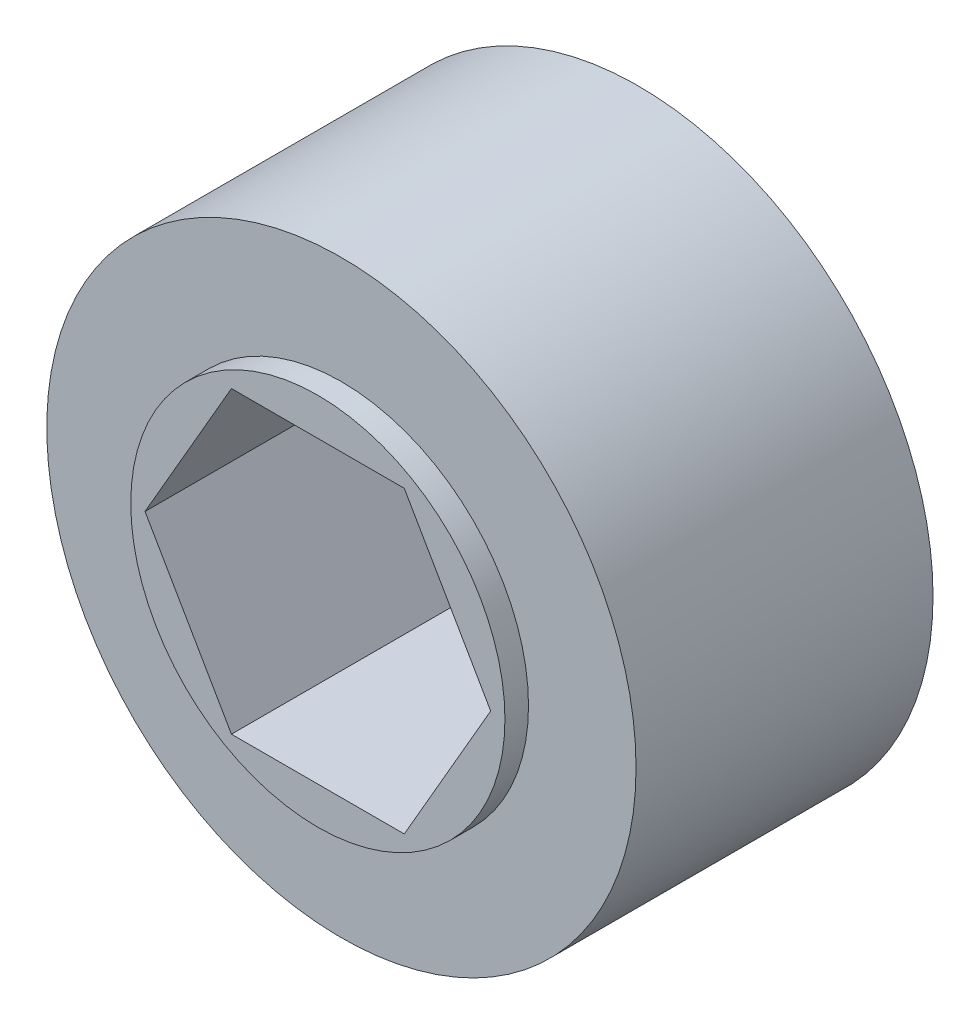
ISO-10303-21;
HEADER;
FILE_DESCRIPTION(('STEP AP214'),'2;1');
FILE_NAME('part.step','',(''),(''),'','','');
FILE_SCHEMA(('AUTOMOTIVE_DESIGN { 1 0 10303 214 1 1 1 1 }'));
ENDSEC;
DATA;
#1=APPLICATION_CONTEXT('core data for automotive mechanical design processes');
#2=APPLICATION_PROTOCOL_DEFINITION('international standard','automotive_design',2000,#1);
#3=PRODUCT_CONTEXT('',#1,'mechanical');
#4=PRODUCT('Part','Part','',(#3));
#5=PRODUCT_RELATED_PRODUCT_CATEGORY('part','',(#4));
#6=PRODUCT_DEFINITION_FORMATION('','',#4);
#7=PRODUCT_DEFINITION_CONTEXT('part definition',#1,'design');
#8=PRODUCT_DEFINITION('design','',#6,#7);
#9=PRODUCT_DEFINITION_SHAPE('','',#8);
#10=(LENGTH_UNIT() NAMED_UNIT(*) SI_UNIT(.MILLI.,.METRE.));
#11=(NAMED_UNIT(*) PLANE_ANGLE_UNIT() SI_UNIT($,.RADIAN.));
#12=(NAMED_UNIT(*) SI_UNIT($,.STERADIAN.) SOLID_ANGLE_UNIT());
#13=UNCERTAINTY_MEASURE_WITH_UNIT(LENGTH_MEASURE(1.E-05),#10,'distance_accuracy_value','');
#14=(GEOMETRIC_REPRESENTATION_CONTEXT(3) GLOBAL_UNCERTAINTY_ASSIGNED_CONTEXT((#13)) GLOBAL_UNIT_ASSIGNED_CONTEXT((#10,
#11,#12)) REPRESENTATION_CONTEXT('',''));
#15=CARTESIAN_POINT('',(0.,0.,0.));
#16=DIRECTION('',(0.,0.,1.));
#17=DIRECTION('',(1.,0.,0.));
#18=AXIS2_PLACEMENT_3D('',#15,#16,#17);
#19=CARTESIAN_POINT('',(0.,0.,6.8));
#20=DIRECTION('',(0.,0.,1.));
#21=DIRECTION('',(1.,0.,0.));
#22=AXIS2_PLACEMENT_3D('',#19,#20,#21);
#23=PLANE('',#22);
#24=DIRECTION('',(-0.5,0.866025403784438,0.));
#25=VECTOR('',#24,1.);
#26=CARTESIAN_POINT('',(7.33234841870825,0.,6.8));
#27=LINE('',#26,#25);
#28=CARTESIAN_POINT('',(7.33234841870825,0.,6.8));
#29=VERTEX_POINT('',#28);
#30=CARTESIAN_POINT('',(3.66617420935412,6.35,6.8));
#31=VERTEX_POINT('',#30);
#32=EDGE_CURVE('E101',#29,#31,#27,.T.);
#33=ORIENTED_EDGE('',*,*,#32,.F.);
#34=DIRECTION('',(0.5,0.866025403784438,0.));
#35=VECTOR('',#34,1.);
#36=CARTESIAN_POINT('',(3.66617420935413,-6.35,6.8));
#37=LINE('',#36,#35);
#38=CARTESIAN_POINT('',(3.66617420935413,-6.35,6.8));
#39=VERTEX_POINT('',#38);
#40=EDGE_CURVE('E93',#39,#29,#37,.T.);
#41=ORIENTED_EDGE('',*,*,#40,.F.);
#42=DIRECTION('',(1.,0.,0.));
#43=VECTOR('',#42,1.);
#44=CARTESIAN_POINT('',(-3.66617420935412,-6.35,6.8));
#45=LINE('',#44,#43);
#46=CARTESIAN_POINT('',(-3.66617420935412,-6.35,6.8));
#47=VERTEX_POINT('',#46);
#48=EDGE_CURVE('E127',#47,#39,#45,.T.);
#49=ORIENTED_EDGE('',*,*,#48,.F.);
#50=DIRECTION('',(0.5,-0.866025403784439,0.));
#51=VECTOR('',#50,1.);
#52=CARTESIAN_POINT('',(-7.33234841870825,0.,6.8));
#53=LINE('',#52,#51);
#54=CARTESIAN_POINT('',(-7.33234841870825,0.,6.8));
#55=VERTEX_POINT('',#54);
#56=EDGE_CURVE('E124',#55,#47,#53,.T.);
#57=ORIENTED_EDGE('',*,*,#56,.F.);
#58=DIRECTION('',(-0.5,-0.866025403784438,0.));
#59=VECTOR('',#58,1.);
#60=CARTESIAN_POINT('',(-3.66617420935413,6.35,6.8));
#61=LINE('',#60,#59);
#62=CARTESIAN_POINT('',(-3.66617420935413,6.35,6.8));
#63=VERTEX_POINT('',#62);
#64=EDGE_CURVE('E118',#63,#55,#61,.T.);
#65=ORIENTED_EDGE('',*,*,#64,.F.);
#66=DIRECTION('',(-1.,0.,0.));
#67=VECTOR('',#66,1.);
#68=CARTESIAN_POINT('',(3.66617420935412,6.35,6.8));
#69=LINE('',#68,#67);
#70=EDGE_CURVE('E114',#31,#63,#69,.T.);
#71=ORIENTED_EDGE('',*,*,#70,.F.);
#72=EDGE_LOOP('',(#33,#41,#49,#57,#65,#71));
#73=FACE_BOUND('',#72,.T.);
#74=CARTESIAN_POINT('',(0.,0.,6.8));
#75=DIRECTION('',(0.,0.,1.));
#76=DIRECTION('',(1.,0.,0.));
#77=AXIS2_PLACEMENT_3D('',#74,#75,#76);
#78=CIRCLE('',#77,7.9375);
#79=CARTESIAN_POINT('',(7.9375,0.,6.8));
#80=VERTEX_POINT('',#79);
#81=EDGE_CURVE('E206',#80,#80,#78,.T.);
#82=ORIENTED_EDGE('',*,*,#81,.T.);
#83=EDGE_LOOP('',(#82));
#84=FACE_BOUND('',#83,.T.);
#85=ADVANCED_FACE('F39',(#73,#84),#23,.T.);
#86=CARTESIAN_POINT('',(0.,0.,6.8));
#87=DIRECTION('',(0.,0.,-1.));
#88=DIRECTION('',(-1.,0.,0.));
#89=AXIS2_PLACEMENT_3D('',#86,#87,#88);
#90=CYLINDRICAL_SURFACE('',#89,12.5);
#91=CARTESIAN_POINT('',(0.,0.,-6.8));
#92=DIRECTION('',(0.,0.,1.));
#93=DIRECTION('',(1.,0.,0.));
#94=AXIS2_PLACEMENT_3D('',#91,#92,#93);
#95=CIRCLE('',#94,12.5);
#96=CARTESIAN_POINT('',(12.5,0.,-6.8));
#97=VERTEX_POINT('',#96);
#98=EDGE_CURVE('E11',#97,#97,#95,.T.);
#99=ORIENTED_EDGE('',*,*,#98,.T.);
#100=EDGE_LOOP('',(#99));
#101=FACE_BOUND('',#100,.T.);
#102=CARTESIAN_POINT('',(0.,0.,5.8));
#103=DIRECTION('',(0.,0.,1.));
#104=DIRECTION('',(1.,0.,0.));
#105=AXIS2_PLACEMENT_3D('',#102,#103,#104);
#106=CIRCLE('',#105,12.5);
#107=CARTESIAN_POINT('',(12.5,0.,5.8));
#108=VERTEX_POINT('',#107);
#109=EDGE_CURVE('E132',#108,#108,#106,.T.);
#110=ORIENTED_EDGE('',*,*,#109,.F.);
#111=EDGE_LOOP('',(#110));
#112=FACE_BOUND('',#111,.T.);
#113=ADVANCED_FACE('F41',(#101,#112),#90,.T.);
#114=CARTESIAN_POINT('',(0.,0.,-6.8));
#115=DIRECTION('',(0.,0.,1.));
#116=DIRECTION('',(1.,0.,0.));
#117=AXIS2_PLACEMENT_3D('',#114,#115,#116);
#118=PLANE('',#117);
#119=ORIENTED_EDGE('',*,*,#98,.F.);
#120=EDGE_LOOP('',(#119));
#121=FACE_BOUND('',#120,.T.);
#122=DIRECTION('',(0.5,0.866025403784438,0.));
#123=VECTOR('',#122,1.);
#124=CARTESIAN_POINT('',(3.66617420935413,-6.35,-6.8));
#125=LINE('',#124,#123);
#126=CARTESIAN_POINT('',(3.66617420935413,-6.35,-6.8));
#127=VERTEX_POINT('',#126);
#128=CARTESIAN_POINT('',(7.33234841870825,0.,-6.8));
#129=VERTEX_POINT('',#128);
#130=EDGE_CURVE('E63',#127,#129,#125,.T.);
#131=ORIENTED_EDGE('',*,*,#130,.T.);
#132=DIRECTION('',(-0.5,0.866025403784438,0.));
#133=VECTOR('',#132,1.);
#134=CARTESIAN_POINT('',(7.33234841870825,0.,-6.8));
#135=LINE('',#134,#133);
#136=CARTESIAN_POINT('',(3.66617420935412,6.35,-6.8));
#137=VERTEX_POINT('',#136);
#138=EDGE_CURVE('E108',#129,#137,#135,.T.);
#139=ORIENTED_EDGE('',*,*,#138,.T.);
#140=DIRECTION('',(-1.,0.,0.));
#141=VECTOR('',#140,1.);
#142=CARTESIAN_POINT('',(3.66617420935412,6.35,-6.8));
#143=LINE('',#142,#141);
#144=CARTESIAN_POINT('',(-3.66617420935413,6.35,-6.8));
#145=VERTEX_POINT('',#144);
#146=EDGE_CURVE('E135',#137,#145,#143,.T.);
#147=ORIENTED_EDGE('',*,*,#146,.T.);
#148=DIRECTION('',(-0.5,-0.866025403784438,0.));
#149=VECTOR('',#148,1.);
#150=CARTESIAN_POINT('',(-3.66617420935413,6.35,-6.8));
#151=LINE('',#150,#149);
#152=CARTESIAN_POINT('',(-7.33234841870825,0.,-6.8));
#153=VERTEX_POINT('',#152);
#154=EDGE_CURVE('E139',#145,#153,#151,.T.);
#155=ORIENTED_EDGE('',*,*,#154,.T.);
#156=DIRECTION('',(0.5,-0.866025403784439,0.));
#157=VECTOR('',#156,1.);
#158=CARTESIAN_POINT('',(-7.33234841870825,0.,-6.8));
#159=LINE('',#158,#157);
#160=CARTESIAN_POINT('',(-3.66617420935412,-6.35,-6.8));
#161=VERTEX_POINT('',#160);
#162=EDGE_CURVE('E143',#153,#161,#159,.T.);
#163=ORIENTED_EDGE('',*,*,#162,.T.);
#164=DIRECTION('',(1.,0.,0.));
#165=VECTOR('',#164,1.);
#166=CARTESIAN_POINT('',(-3.66617420935412,-6.35,-6.8));
#167=LINE('',#166,#165);
#168=EDGE_CURVE('E102',#161,#127,#167,.T.);
#169=ORIENTED_EDGE('',*,*,#168,.T.);
#170=EDGE_LOOP('',(#131,#139,#147,#155,#163,#169));
#171=FACE_BOUND('',#170,.T.);
#172=ADVANCED_FACE('F167',(#121,#171),#118,.F.);
#173=CARTESIAN_POINT('',(3.66617420935413,-6.35,6.8));
#174=DIRECTION('',(-0.866025403784439,0.5,0.));
#175=DIRECTION('',(-0.5,-0.866025403784439,0.));
#176=AXIS2_PLACEMENT_3D('',#173,#174,#175);
#177=PLANE('',#176);
#178=ORIENTED_EDGE('',*,*,#130,.F.);
#179=DIRECTION('',(0.,0.,-1.));
#180=VECTOR('',#179,1.);
#181=CARTESIAN_POINT('',(3.66617420935413,-6.35,6.8));
#182=LINE('',#181,#180);
#183=EDGE_CURVE('E96',#39,#127,#182,.T.);
#184=ORIENTED_EDGE('',*,*,#183,.F.);
#185=ORIENTED_EDGE('',*,*,#40,.T.);
#186=DIRECTION('',(0.,0.,-1.));
#187=VECTOR('',#186,1.);
#188=CARTESIAN_POINT('',(7.33234841870825,0.,6.8));
#189=LINE('',#188,#187);
#190=EDGE_CURVE('E48',#29,#129,#189,.T.);
#191=ORIENTED_EDGE('',*,*,#190,.T.);
#192=EDGE_LOOP('',(#178,#184,#185,#191));
#193=FACE_BOUND('',#192,.T.);
#194=ADVANCED_FACE('F95',(#193),#177,.T.);
#195=CARTESIAN_POINT('',(7.33234841870825,0.,6.8));
#196=DIRECTION('',(-0.866025403784439,-0.5,0.));
#197=DIRECTION('',(0.5,-0.866025403784439,0.));
#198=AXIS2_PLACEMENT_3D('',#195,#196,#197);
#199=PLANE('',#198);
#200=ORIENTED_EDGE('',*,*,#138,.F.);
#201=ORIENTED_EDGE('',*,*,#190,.F.);
#202=ORIENTED_EDGE('',*,*,#32,.T.);
#203=DIRECTION('',(0.,0.,-1.));
#204=VECTOR('',#203,1.);
#205=CARTESIAN_POINT('',(3.66617420935412,6.35,6.8));
#206=LINE('',#205,#204);
#207=EDGE_CURVE('E110',#31,#137,#206,.T.);
#208=ORIENTED_EDGE('',*,*,#207,.T.);
#209=EDGE_LOOP('',(#200,#201,#202,#208));
#210=FACE_BOUND('',#209,.T.);
#211=ADVANCED_FACE('F105',(#210),#199,.T.);
#212=CARTESIAN_POINT('',(3.66617420935412,6.35,6.8));
#213=DIRECTION('',(0.,-1.,0.));
#214=DIRECTION('',(0.,0.,-1.));
#215=AXIS2_PLACEMENT_3D('',#212,#213,#214);
#216=PLANE('',#215);
#217=ORIENTED_EDGE('',*,*,#146,.F.);
#218=ORIENTED_EDGE('',*,*,#207,.F.);
#219=ORIENTED_EDGE('',*,*,#70,.T.);
#220=DIRECTION('',(0.,0.,-1.));
#221=VECTOR('',#220,1.);
#222=CARTESIAN_POINT('',(-3.66617420935413,6.35,6.8));
#223=LINE('',#222,#221);
#224=EDGE_CURVE('E157',#63,#145,#223,.T.);
#225=ORIENTED_EDGE('',*,*,#224,.T.);
#226=EDGE_LOOP('',(#217,#218,#219,#225));
#227=FACE_BOUND('',#226,.T.);
#228=ADVANCED_FACE('F163',(#227),#216,.T.);
#229=CARTESIAN_POINT('',(-3.66617420935413,6.35,6.8));
#230=DIRECTION('',(0.866025403784439,-0.5,0.));
#231=DIRECTION('',(0.5,0.866025403784439,0.));
#232=AXIS2_PLACEMENT_3D('',#229,#230,#231);
#233=PLANE('',#232);
#234=ORIENTED_EDGE('',*,*,#154,.F.);
#235=ORIENTED_EDGE('',*,*,#224,.F.);
#236=ORIENTED_EDGE('',*,*,#64,.T.);
#237=DIRECTION('',(0.,0.,-1.));
#238=VECTOR('',#237,1.);
#239=CARTESIAN_POINT('',(-7.33234841870825,0.,6.8));
#240=LINE('',#239,#238);
#241=EDGE_CURVE('E154',#55,#153,#240,.T.);
#242=ORIENTED_EDGE('',*,*,#241,.T.);
#243=EDGE_LOOP('',(#234,#235,#236,#242));
#244=FACE_BOUND('',#243,.T.);
#245=ADVANCED_FACE('F175',(#244),#233,.T.);
#246=CARTESIAN_POINT('',(-7.33234841870825,0.,6.8));
#247=DIRECTION('',(0.866025403784439,0.5,0.));
#248=DIRECTION('',(-0.5,0.866025403784439,0.));
#249=AXIS2_PLACEMENT_3D('',#246,#247,#248);
#250=PLANE('',#249);
#251=ORIENTED_EDGE('',*,*,#162,.F.);
#252=ORIENTED_EDGE('',*,*,#241,.F.);
#253=ORIENTED_EDGE('',*,*,#56,.T.);
#254=DIRECTION('',(0.,0.,-1.));
#255=VECTOR('',#254,1.);
#256=CARTESIAN_POINT('',(-3.66617420935412,-6.35,6.8));
#257=LINE('',#256,#255);
#258=EDGE_CURVE('E55',#47,#161,#257,.T.);
#259=ORIENTED_EDGE('',*,*,#258,.T.);
#260=EDGE_LOOP('',(#251,#252,#253,#259));
#261=FACE_BOUND('',#260,.T.);
#262=ADVANCED_FACE('F173',(#261),#250,.T.);
#263=CARTESIAN_POINT('',(-3.66617420935412,-6.35,6.8));
#264=DIRECTION('',(0.,1.,0.));
#265=DIRECTION('',(-1.,0.,0.));
#266=AXIS2_PLACEMENT_3D('',#263,#264,#265);
#267=PLANE('',#266);
#268=ORIENTED_EDGE('',*,*,#168,.F.);
#269=ORIENTED_EDGE('',*,*,#258,.F.);
#270=ORIENTED_EDGE('',*,*,#48,.T.);
#271=ORIENTED_EDGE('',*,*,#183,.T.);
#272=EDGE_LOOP('',(#268,#269,#270,#271));
#273=FACE_BOUND('',#272,.T.);
#274=ADVANCED_FACE('F169',(#273),#267,.T.);
#275=CARTESIAN_POINT('',(0.,0.,5.8));
#276=DIRECTION('',(0.,0.,1.));
#277=DIRECTION('',(1.,0.,0.));
#278=AXIS2_PLACEMENT_3D('',#275,#276,#277);
#279=PLANE('',#278);
#280=CARTESIAN_POINT('',(0.,0.,5.8));
#281=DIRECTION('',(0.,0.,1.));
#282=DIRECTION('',(1.,0.,0.));
#283=AXIS2_PLACEMENT_3D('',#280,#281,#282);
#284=CIRCLE('',#283,7.9375);
#285=CARTESIAN_POINT('',(7.9375,0.,5.8));
#286=VERTEX_POINT('',#285);
#287=EDGE_CURVE('E203',#286,#286,#284,.T.);
#288=ORIENTED_EDGE('',*,*,#287,.F.);
#289=EDGE_LOOP('',(#288));
#290=FACE_BOUND('',#289,.T.);
#291=ORIENTED_EDGE('',*,*,#109,.T.);
#292=EDGE_LOOP('',(#291));
#293=FACE_BOUND('',#292,.T.);
#294=ADVANCED_FACE('F215',(#290,#293),#279,.T.);
#295=CARTESIAN_POINT('',(0.,0.,5.8));
#296=DIRECTION('',(0.,0.,1.));
#297=DIRECTION('',(1.,0.,0.));
#298=AXIS2_PLACEMENT_3D('',#295,#296,#297);
#299=CYLINDRICAL_SURFACE('',#298,7.9375);
#300=ORIENTED_EDGE('',*,*,#287,.T.);
#301=EDGE_LOOP('',(#300));
#302=FACE_BOUND('',#301,.T.);
#303=ORIENTED_EDGE('',*,*,#81,.F.);
#304=EDGE_LOOP('',(#303));
#305=FACE_BOUND('',#304,.T.);
#306=ADVANCED_FACE('F213',(#302,#305),#299,.T.);
#307=CLOSED_SHELL('',(#85,#113,#172,#194,#211,#228,#245,#262,#274,#294,#306));
#308=MANIFOLD_SOLID_BREP('B2',#307);
#309=ADVANCED_BREP_SHAPE_REPRESENTATION('',(#18,#308),#14);
#310=SHAPE_DEFINITION_REPRESENTATION(#9,#309);
ENDSEC;
END-ISO-10303-21;
